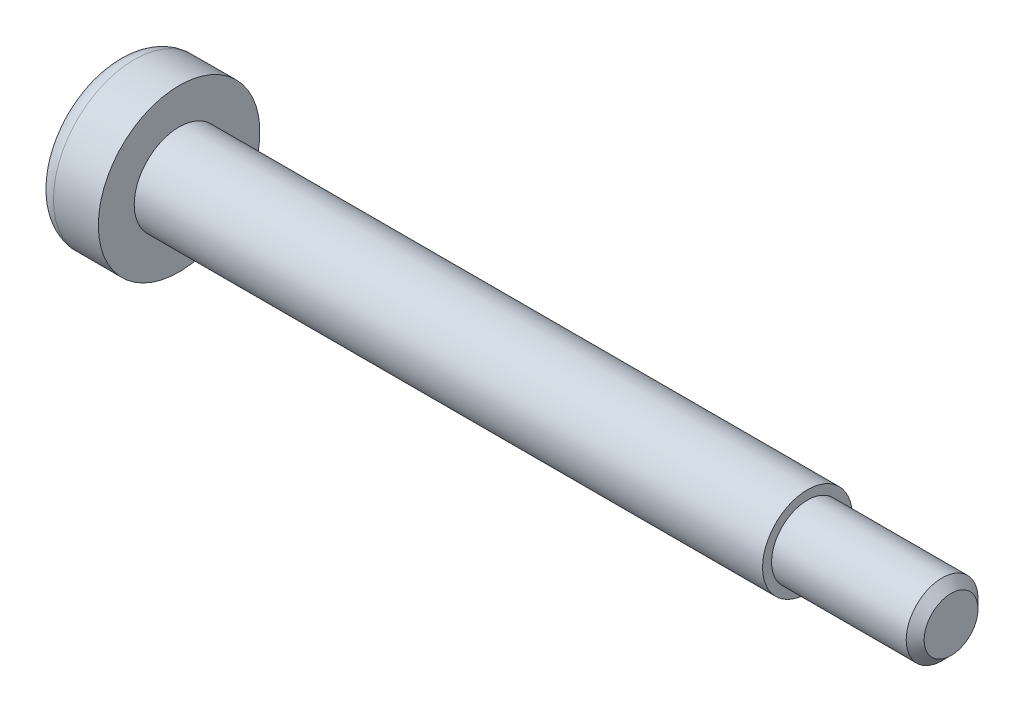
ISO-10303-21;
HEADER;
FILE_DESCRIPTION(('STEP AP214'),'2;1');
FILE_NAME('part.step','',(''),(''),'','','');
FILE_SCHEMA(('AUTOMOTIVE_DESIGN { 1 0 10303 214 1 1 1 1 }'));
ENDSEC;
DATA;
#1=APPLICATION_CONTEXT('core data for automotive mechanical design processes');
#2=APPLICATION_PROTOCOL_DEFINITION('international standard','automotive_design',2000,#1);
#3=PRODUCT_CONTEXT('',#1,'mechanical');
#4=PRODUCT('Part','Part','',(#3));
#5=PRODUCT_RELATED_PRODUCT_CATEGORY('part','',(#4));
#6=PRODUCT_DEFINITION_FORMATION('','',#4);
#7=PRODUCT_DEFINITION_CONTEXT('part definition',#1,'design');
#8=PRODUCT_DEFINITION('design','',#6,#7);
#9=PRODUCT_DEFINITION_SHAPE('','',#8);
#10=(LENGTH_UNIT() NAMED_UNIT(*) SI_UNIT(.MILLI.,.METRE.));
#11=(NAMED_UNIT(*) PLANE_ANGLE_UNIT() SI_UNIT($,.RADIAN.));
#12=(NAMED_UNIT(*) SI_UNIT($,.STERADIAN.) SOLID_ANGLE_UNIT());
#13=UNCERTAINTY_MEASURE_WITH_UNIT(LENGTH_MEASURE(1.E-05),#10,'distance_accuracy_value','');
#14=(GEOMETRIC_REPRESENTATION_CONTEXT(3) GLOBAL_UNCERTAINTY_ASSIGNED_CONTEXT((#13)) GLOBAL_UNIT_ASSIGNED_CONTEXT((#10,
#11,#12)) REPRESENTATION_CONTEXT('',''));
#15=CARTESIAN_POINT('',(0.,0.,0.));
#16=DIRECTION('',(0.,0.,1.));
#17=DIRECTION('',(1.,0.,0.));
#18=AXIS2_PLACEMENT_3D('',#15,#16,#17);
#19=CARTESIAN_POINT('',(0.,0.,0.));
#20=DIRECTION('',(1.,0.,0.));
#21=DIRECTION('',(0.,0.,-1.));
#22=AXIS2_PLACEMENT_3D('',#19,#20,#21);
#23=PLANE('',#22);
#24=CARTESIAN_POINT('',(0.,0.,0.));
#25=DIRECTION('',(1.,0.,0.));
#26=DIRECTION('',(0.,0.,-1.));
#27=AXIS2_PLACEMENT_3D('',#24,#25,#26);
#28=CIRCLE('',#27,3.5);
#29=CARTESIAN_POINT('',(0.,0.,-3.5));
#30=VERTEX_POINT('',#29);
#31=EDGE_CURVE('E158',#30,#30,#28,.F.);
#32=ORIENTED_EDGE('',*,*,#31,.T.);
#33=EDGE_LOOP('',(#32));
#34=FACE_BOUND('',#33,.T.);
#35=DIRECTION('',(0.,-0.5,-0.866025403784439));
#36=VECTOR('',#35,1.);
#37=CARTESIAN_POINT('',(0.,1.73205080756888,0.));
#38=LINE('',#37,#36);
#39=CARTESIAN_POINT('',(0.,1.73205080756888,0.));
#40=VERTEX_POINT('',#39);
#41=CARTESIAN_POINT('',(0.,0.866025403784439,-1.5));
#42=VERTEX_POINT('',#41);
#43=EDGE_CURVE('E128',#40,#42,#38,.T.);
#44=ORIENTED_EDGE('',*,*,#43,.F.);
#45=DIRECTION('',(0.,0.5,-0.866025403784439));
#46=VECTOR('',#45,1.);
#47=CARTESIAN_POINT('',(0.,0.86602540378444,1.5));
#48=LINE('',#47,#46);
#49=CARTESIAN_POINT('',(0.,0.86602540378444,1.5));
#50=VERTEX_POINT('',#49);
#51=EDGE_CURVE('E54',#50,#40,#48,.T.);
#52=ORIENTED_EDGE('',*,*,#51,.F.);
#53=DIRECTION('',(0.,1.,0.));
#54=VECTOR('',#53,1.);
#55=CARTESIAN_POINT('',(0.,-0.866025403784439,1.5));
#56=LINE('',#55,#54);
#57=CARTESIAN_POINT('',(0.,-0.866025403784439,1.5));
#58=VERTEX_POINT('',#57);
#59=EDGE_CURVE('E137',#58,#50,#56,.T.);
#60=ORIENTED_EDGE('',*,*,#59,.F.);
#61=DIRECTION('',(0.,0.5,0.866025403784439));
#62=VECTOR('',#61,1.);
#63=CARTESIAN_POINT('',(0.,-1.73205080756888,0.));
#64=LINE('',#63,#62);
#65=CARTESIAN_POINT('',(0.,-1.73205080756888,0.));
#66=VERTEX_POINT('',#65);
#67=EDGE_CURVE('E135',#66,#58,#64,.T.);
#68=ORIENTED_EDGE('',*,*,#67,.F.);
#69=DIRECTION('',(0.,-0.5,0.866025403784439));
#70=VECTOR('',#69,1.);
#71=CARTESIAN_POINT('',(0.,-0.866025403784439,-1.5));
#72=LINE('',#71,#70);
#73=CARTESIAN_POINT('',(0.,-0.866025403784439,-1.5));
#74=VERTEX_POINT('',#73);
#75=EDGE_CURVE('E102',#74,#66,#72,.T.);
#76=ORIENTED_EDGE('',*,*,#75,.F.);
#77=DIRECTION('',(0.,-1.,0.));
#78=VECTOR('',#77,1.);
#79=CARTESIAN_POINT('',(0.,0.866025403784439,-1.5));
#80=LINE('',#79,#78);
#81=EDGE_CURVE('E131',#42,#74,#80,.T.);
#82=ORIENTED_EDGE('',*,*,#81,.F.);
#83=EDGE_LOOP('',(#44,#52,#60,#68,#76,#82));
#84=FACE_BOUND('',#83,.T.);
#85=ADVANCED_FACE('F39',(#34,#84),#23,.F.);
#86=CARTESIAN_POINT('',(0.,0.,0.));
#87=DIRECTION('',(-1.,0.,0.));
#88=DIRECTION('',(0.,0.,1.));
#89=AXIS2_PLACEMENT_3D('',#86,#87,#88);
#90=CYLINDRICAL_SURFACE('',#89,4.5);
#91=CARTESIAN_POINT('',(1.,0.,0.));
#92=DIRECTION('',(1.,0.,0.));
#93=DIRECTION('',(0.,0.,-1.));
#94=AXIS2_PLACEMENT_3D('',#91,#92,#93);
#95=CIRCLE('',#94,4.5);
#96=CARTESIAN_POINT('',(1.,0.,-4.5));
#97=VERTEX_POINT('',#96);
#98=EDGE_CURVE('E161',#97,#97,#95,.T.);
#99=ORIENTED_EDGE('',*,*,#98,.T.);
#100=EDGE_LOOP('',(#99));
#101=FACE_BOUND('',#100,.T.);
#102=CARTESIAN_POINT('',(3.5,0.,0.));
#103=DIRECTION('',(-1.,0.,0.));
#104=DIRECTION('',(0.,0.,1.));
#105=AXIS2_PLACEMENT_3D('',#102,#103,#104);
#106=CIRCLE('',#105,4.5);
#107=CARTESIAN_POINT('',(3.5,0.,4.5));
#108=VERTEX_POINT('',#107);
#109=EDGE_CURVE('E155',#108,#108,#106,.T.);
#110=ORIENTED_EDGE('',*,*,#109,.T.);
#111=EDGE_LOOP('',(#110));
#112=FACE_BOUND('',#111,.T.);
#113=ADVANCED_FACE('F178',(#101,#112),#90,.T.);
#114=CARTESIAN_POINT('',(3.5,4.5,0.));
#115=DIRECTION('',(-1.,0.,0.));
#116=DIRECTION('',(0.,0.,1.));
#117=AXIS2_PLACEMENT_3D('',#114,#115,#116);
#118=PLANE('',#117);
#119=ORIENTED_EDGE('',*,*,#109,.F.);
#120=EDGE_LOOP('',(#119));
#121=FACE_BOUND('',#120,.T.);
#122=CARTESIAN_POINT('',(3.5,0.,0.));
#123=DIRECTION('',(-1.,0.,0.));
#124=DIRECTION('',(0.,0.,1.));
#125=AXIS2_PLACEMENT_3D('',#122,#123,#124);
#126=CIRCLE('',#125,2.5);
#127=CARTESIAN_POINT('',(3.5,0.,2.5));
#128=VERTEX_POINT('',#127);
#129=EDGE_CURVE('E152',#128,#128,#126,.T.);
#130=ORIENTED_EDGE('',*,*,#129,.T.);
#131=EDGE_LOOP('',(#130));
#132=FACE_BOUND('',#131,.T.);
#133=ADVANCED_FACE('F184',(#121,#132),#118,.F.);
#134=CARTESIAN_POINT('',(0.,0.,0.));
#135=DIRECTION('',(-1.,0.,0.));
#136=DIRECTION('',(0.,0.,1.));
#137=AXIS2_PLACEMENT_3D('',#134,#135,#136);
#138=CYLINDRICAL_SURFACE('',#137,2.5);
#139=ORIENTED_EDGE('',*,*,#129,.F.);
#140=EDGE_LOOP('',(#139));
#141=FACE_BOUND('',#140,.T.);
#142=CARTESIAN_POINT('',(38.5,0.,0.));
#143=DIRECTION('',(-1.,0.,0.));
#144=DIRECTION('',(0.,0.,1.));
#145=AXIS2_PLACEMENT_3D('',#142,#143,#144);
#146=CIRCLE('',#145,2.5);
#147=CARTESIAN_POINT('',(38.5,0.,2.5));
#148=VERTEX_POINT('',#147);
#149=EDGE_CURVE('E149',#148,#148,#146,.T.);
#150=ORIENTED_EDGE('',*,*,#149,.T.);
#151=EDGE_LOOP('',(#150));
#152=FACE_BOUND('',#151,.T.);
#153=ADVANCED_FACE('F191',(#141,#152),#138,.T.);
#154=CARTESIAN_POINT('',(38.5,2.5,0.));
#155=DIRECTION('',(-1.,0.,0.));
#156=DIRECTION('',(0.,0.,1.));
#157=AXIS2_PLACEMENT_3D('',#154,#155,#156);
#158=PLANE('',#157);
#159=ORIENTED_EDGE('',*,*,#149,.F.);
#160=EDGE_LOOP('',(#159));
#161=FACE_BOUND('',#160,.T.);
#162=CARTESIAN_POINT('',(38.5,0.,0.));
#163=DIRECTION('',(-1.,0.,0.));
#164=DIRECTION('',(0.,0.,1.));
#165=AXIS2_PLACEMENT_3D('',#162,#163,#164);
#166=CIRCLE('',#165,2.);
#167=CARTESIAN_POINT('',(38.5,0.,2.));
#168=VERTEX_POINT('',#167);
#169=EDGE_CURVE('E141',#168,#168,#166,.T.);
#170=ORIENTED_EDGE('',*,*,#169,.T.);
#171=EDGE_LOOP('',(#170));
#172=FACE_BOUND('',#171,.T.);
#173=ADVANCED_FACE('F195',(#161,#172),#158,.F.);
#174=CARTESIAN_POINT('',(0.,0.,0.));
#175=DIRECTION('',(-1.,0.,0.));
#176=DIRECTION('',(0.,0.,1.));
#177=AXIS2_PLACEMENT_3D('',#174,#175,#176);
#178=CYLINDRICAL_SURFACE('',#177,2.);
#179=CARTESIAN_POINT('',(46.,0.,0.));
#180=DIRECTION('',(-1.,0.,0.));
#181=DIRECTION('',(0.,0.,1.));
#182=AXIS2_PLACEMENT_3D('',#179,#180,#181);
#183=CIRCLE('',#182,2.);
#184=CARTESIAN_POINT('',(46.,0.,2.));
#185=VERTEX_POINT('',#184);
#186=EDGE_CURVE('E47',#185,#185,#183,.T.);
#187=ORIENTED_EDGE('',*,*,#186,.T.);
#188=EDGE_LOOP('',(#187));
#189=FACE_BOUND('',#188,.T.);
#190=ORIENTED_EDGE('',*,*,#169,.F.);
#191=EDGE_LOOP('',(#190));
#192=FACE_BOUND('',#191,.T.);
#193=ADVANCED_FACE('F166',(#189,#192),#178,.T.);
#194=CARTESIAN_POINT('',(46.5,2.,0.));
#195=DIRECTION('',(-1.,0.,0.));
#196=DIRECTION('',(0.,0.,1.));
#197=AXIS2_PLACEMENT_3D('',#194,#195,#196);
#198=PLANE('',#197);
#199=CARTESIAN_POINT('',(46.5,0.,0.));
#200=DIRECTION('',(-1.,0.,0.));
#201=DIRECTION('',(0.,0.,1.));
#202=AXIS2_PLACEMENT_3D('',#199,#200,#201);
#203=CIRCLE('',#202,1.50000000000002);
#204=CARTESIAN_POINT('',(46.5,0.,1.50000000000002));
#205=VERTEX_POINT('',#204);
#206=EDGE_CURVE('E11',#205,#205,#203,.F.);
#207=ORIENTED_EDGE('',*,*,#206,.T.);
#208=EDGE_LOOP('',(#207));
#209=FACE_BOUND('',#208,.T.);
#210=ADVANCED_FACE('F202',(#209),#198,.F.);
#211=CARTESIAN_POINT('',(2.4,0.86602540378444,1.5));
#212=DIRECTION('',(0.,0.866025403784439,0.5));
#213=DIRECTION('',(0.,-0.5,0.866025403784439));
#214=AXIS2_PLACEMENT_3D('',#211,#212,#213);
#215=PLANE('',#214);
#216=ORIENTED_EDGE('',*,*,#51,.T.);
#217=DIRECTION('',(-1.,0.,0.));
#218=VECTOR('',#217,1.);
#219=CARTESIAN_POINT('',(2.4,1.73205080756888,0.));
#220=LINE('',#219,#218);
#221=CARTESIAN_POINT('',(2.4,1.73205080756888,0.));
#222=VERTEX_POINT('',#221);
#223=EDGE_CURVE('E84',#222,#40,#220,.T.);
#224=ORIENTED_EDGE('',*,*,#223,.F.);
#225=DIRECTION('',(0.,0.5,-0.866025403784439));
#226=VECTOR('',#225,1.);
#227=CARTESIAN_POINT('',(2.4,0.86602540378444,1.5));
#228=LINE('',#227,#226);
#229=CARTESIAN_POINT('',(2.4,0.86602540378444,1.5));
#230=VERTEX_POINT('',#229);
#231=EDGE_CURVE('E139',#230,#222,#228,.T.);
#232=ORIENTED_EDGE('',*,*,#231,.F.);
#233=DIRECTION('',(-1.,0.,0.));
#234=VECTOR('',#233,1.);
#235=CARTESIAN_POINT('',(2.4,0.86602540378444,1.5));
#236=LINE('',#235,#234);
#237=EDGE_CURVE('E62',#230,#50,#236,.T.);
#238=ORIENTED_EDGE('',*,*,#237,.T.);
#239=EDGE_LOOP('',(#216,#224,#232,#238));
#240=FACE_BOUND('',#239,.T.);
#241=ADVANCED_FACE('F205',(#240),#215,.F.);
#242=CARTESIAN_POINT('',(2.4,-0.866025403784439,1.5));
#243=DIRECTION('',(0.,0.,1.));
#244=DIRECTION('',(1.,0.,0.));
#245=AXIS2_PLACEMENT_3D('',#242,#243,#244);
#246=PLANE('',#245);
#247=ORIENTED_EDGE('',*,*,#59,.T.);
#248=ORIENTED_EDGE('',*,*,#237,.F.);
#249=DIRECTION('',(0.,1.,0.));
#250=VECTOR('',#249,1.);
#251=CARTESIAN_POINT('',(2.4,-0.866025403784439,1.5));
#252=LINE('',#251,#250);
#253=CARTESIAN_POINT('',(2.4,-0.866025403784439,1.5));
#254=VERTEX_POINT('',#253);
#255=EDGE_CURVE('E114',#254,#230,#252,.T.);
#256=ORIENTED_EDGE('',*,*,#255,.F.);
#257=DIRECTION('',(-1.,0.,0.));
#258=VECTOR('',#257,1.);
#259=CARTESIAN_POINT('',(2.4,-0.866025403784439,1.5));
#260=LINE('',#259,#258);
#261=EDGE_CURVE('E106',#254,#58,#260,.T.);
#262=ORIENTED_EDGE('',*,*,#261,.T.);
#263=EDGE_LOOP('',(#247,#248,#256,#262));
#264=FACE_BOUND('',#263,.T.);
#265=ADVANCED_FACE('F209',(#264),#246,.F.);
#266=CARTESIAN_POINT('',(2.4,-1.73205080756888,0.));
#267=DIRECTION('',(0.,-0.866025403784439,0.5));
#268=DIRECTION('',(0.,-0.5,-0.866025403784439));
#269=AXIS2_PLACEMENT_3D('',#266,#267,#268);
#270=PLANE('',#269);
#271=ORIENTED_EDGE('',*,*,#67,.T.);
#272=ORIENTED_EDGE('',*,*,#261,.F.);
#273=DIRECTION('',(0.,0.5,0.866025403784439));
#274=VECTOR('',#273,1.);
#275=CARTESIAN_POINT('',(2.4,-1.73205080756888,0.));
#276=LINE('',#275,#274);
#277=CARTESIAN_POINT('',(2.4,-1.73205080756888,0.));
#278=VERTEX_POINT('',#277);
#279=EDGE_CURVE('E110',#278,#254,#276,.T.);
#280=ORIENTED_EDGE('',*,*,#279,.F.);
#281=DIRECTION('',(-1.,0.,0.));
#282=VECTOR('',#281,1.);
#283=CARTESIAN_POINT('',(2.4,-1.73205080756888,0.));
#284=LINE('',#283,#282);
#285=EDGE_CURVE('E95',#278,#66,#284,.T.);
#286=ORIENTED_EDGE('',*,*,#285,.T.);
#287=EDGE_LOOP('',(#271,#272,#280,#286));
#288=FACE_BOUND('',#287,.T.);
#289=ADVANCED_FACE('F111',(#288),#270,.F.);
#290=CARTESIAN_POINT('',(2.4,-0.866025403784439,-1.5));
#291=DIRECTION('',(0.,-0.866025403784439,-0.5));
#292=DIRECTION('',(0.,0.5,-0.866025403784439));
#293=AXIS2_PLACEMENT_3D('',#290,#291,#292);
#294=PLANE('',#293);
#295=ORIENTED_EDGE('',*,*,#75,.T.);
#296=ORIENTED_EDGE('',*,*,#285,.F.);
#297=DIRECTION('',(0.,-0.5,0.866025403784439));
#298=VECTOR('',#297,1.);
#299=CARTESIAN_POINT('',(2.4,-0.866025403784439,-1.5));
#300=LINE('',#299,#298);
#301=CARTESIAN_POINT('',(2.4,-0.866025403784439,-1.5));
#302=VERTEX_POINT('',#301);
#303=EDGE_CURVE('E99',#302,#278,#300,.T.);
#304=ORIENTED_EDGE('',*,*,#303,.F.);
#305=DIRECTION('',(-1.,0.,0.));
#306=VECTOR('',#305,1.);
#307=CARTESIAN_POINT('',(2.4,-0.866025403784439,-1.5));
#308=LINE('',#307,#306);
#309=EDGE_CURVE('E107',#302,#74,#308,.T.);
#310=ORIENTED_EDGE('',*,*,#309,.T.);
#311=EDGE_LOOP('',(#295,#296,#304,#310));
#312=FACE_BOUND('',#311,.T.);
#313=ADVANCED_FACE('F97',(#312),#294,.F.);
#314=CARTESIAN_POINT('',(2.4,0.866025403784439,-1.5));
#315=DIRECTION('',(0.,0.,-1.));
#316=DIRECTION('',(-1.,0.,0.));
#317=AXIS2_PLACEMENT_3D('',#314,#315,#316);
#318=PLANE('',#317);
#319=ORIENTED_EDGE('',*,*,#81,.T.);
#320=ORIENTED_EDGE('',*,*,#309,.F.);
#321=DIRECTION('',(0.,-1.,0.));
#322=VECTOR('',#321,1.);
#323=CARTESIAN_POINT('',(2.4,0.866025403784439,-1.5));
#324=LINE('',#323,#322);
#325=CARTESIAN_POINT('',(2.4,0.866025403784439,-1.5));
#326=VERTEX_POINT('',#325);
#327=EDGE_CURVE('E120',#326,#302,#324,.T.);
#328=ORIENTED_EDGE('',*,*,#327,.F.);
#329=DIRECTION('',(-1.,0.,0.));
#330=VECTOR('',#329,1.);
#331=CARTESIAN_POINT('',(2.4,0.866025403784439,-1.5));
#332=LINE('',#331,#330);
#333=EDGE_CURVE('E144',#326,#42,#332,.T.);
#334=ORIENTED_EDGE('',*,*,#333,.T.);
#335=EDGE_LOOP('',(#319,#320,#328,#334));
#336=FACE_BOUND('',#335,.T.);
#337=ADVANCED_FACE('F213',(#336),#318,.F.);
#338=CARTESIAN_POINT('',(2.4,1.73205080756888,0.));
#339=DIRECTION('',(0.,0.866025403784439,-0.5));
#340=DIRECTION('',(0.,0.5,0.866025403784439));
#341=AXIS2_PLACEMENT_3D('',#338,#339,#340);
#342=PLANE('',#341);
#343=ORIENTED_EDGE('',*,*,#43,.T.);
#344=ORIENTED_EDGE('',*,*,#333,.F.);
#345=DIRECTION('',(0.,-0.5,-0.866025403784439));
#346=VECTOR('',#345,1.);
#347=CARTESIAN_POINT('',(2.4,1.73205080756888,0.));
#348=LINE('',#347,#346);
#349=EDGE_CURVE('E122',#222,#326,#348,.T.);
#350=ORIENTED_EDGE('',*,*,#349,.F.);
#351=ORIENTED_EDGE('',*,*,#223,.T.);
#352=EDGE_LOOP('',(#343,#344,#350,#351));
#353=FACE_BOUND('',#352,.T.);
#354=ADVANCED_FACE('F210',(#353),#342,.F.);
#355=CARTESIAN_POINT('',(2.4,0.,0.));
#356=DIRECTION('',(-1.,0.,0.));
#357=DIRECTION('',(0.,0.,1.));
#358=AXIS2_PLACEMENT_3D('',#355,#356,#357);
#359=PLANE('',#358);
#360=ORIENTED_EDGE('',*,*,#231,.T.);
#361=ORIENTED_EDGE('',*,*,#349,.T.);
#362=ORIENTED_EDGE('',*,*,#327,.T.);
#363=ORIENTED_EDGE('',*,*,#303,.T.);
#364=ORIENTED_EDGE('',*,*,#279,.T.);
#365=ORIENTED_EDGE('',*,*,#255,.T.);
#366=EDGE_LOOP('',(#360,#361,#362,#363,#364,#365));
#367=FACE_BOUND('',#366,.T.);
#368=ADVANCED_FACE('F117',(#367),#359,.T.);
#369=CARTESIAN_POINT('',(1.,0.,0.));
#370=DIRECTION('',(1.,0.,0.));
#371=DIRECTION('',(0.,0.,-1.));
#372=AXIS2_PLACEMENT_3D('',#369,#370,#371);
#373=TOROIDAL_SURFACE('',#372,3.5,1.);
#374=ORIENTED_EDGE('',*,*,#98,.F.);
#375=EDGE_LOOP('',(#374));
#376=FACE_BOUND('',#375,.T.);
#377=ORIENTED_EDGE('',*,*,#31,.F.);
#378=EDGE_LOOP('',(#377));
#379=FACE_BOUND('',#378,.T.);
#380=ADVANCED_FACE('F170',(#376,#379),#373,.T.);
#381=CARTESIAN_POINT('',(46.,0.,0.));
#382=DIRECTION('',(-1.,0.,0.));
#383=DIRECTION('',(0.,0.,1.));
#384=AXIS2_PLACEMENT_3D('',#381,#382,#383);
#385=CONICAL_SURFACE('',#384,2.,0.785398163397447);
#386=ORIENTED_EDGE('',*,*,#206,.F.);
#387=EDGE_LOOP('',(#386));
#388=FACE_BOUND('',#387,.T.);
#389=ORIENTED_EDGE('',*,*,#186,.F.);
#390=EDGE_LOOP('',(#389));
#391=FACE_BOUND('',#390,.T.);
#392=ADVANCED_FACE('F41',(#388,#391),#385,.T.);
#393=CLOSED_SHELL('',(#85,#113,#133,#153,#173,#193,#210,#241,#265,#289,#313,#337,#354,#368,#380,#392));
#394=MANIFOLD_SOLID_BREP('B2',#393);
#395=ADVANCED_BREP_SHAPE_REPRESENTATION('',(#18,#394),#14);
#396=SHAPE_DEFINITION_REPRESENTATION(#9,#395);
ENDSEC;
END-ISO-10303-21;
